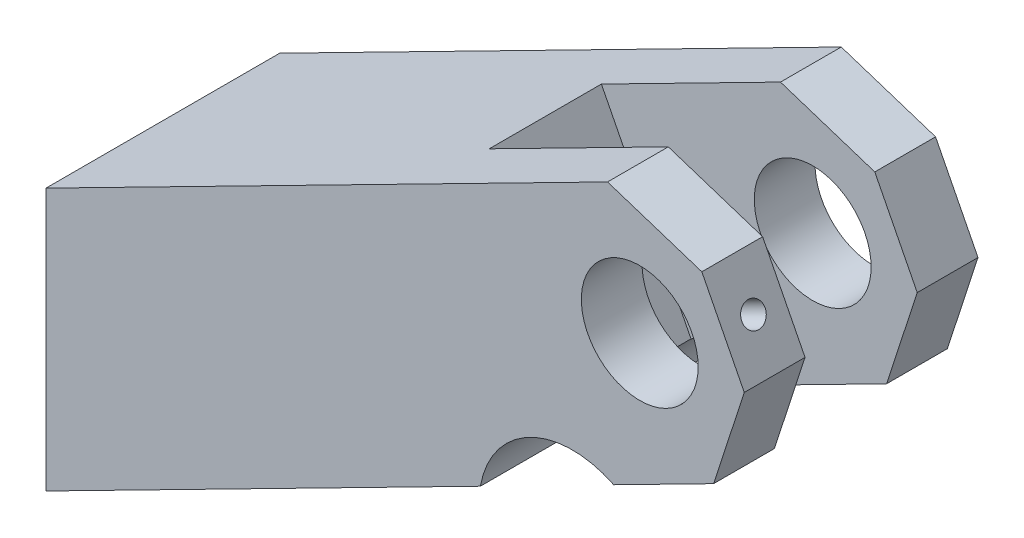
ISO-10303-21;
HEADER;
FILE_DESCRIPTION(('STEP AP214'),'2;1');
FILE_NAME('part.step','',(''),(''),'','','');
FILE_SCHEMA(('AUTOMOTIVE_DESIGN { 1 0 10303 214 1 1 1 1 }'));
ENDSEC;
DATA;
#1=APPLICATION_CONTEXT('core data for automotive mechanical design processes');
#2=APPLICATION_PROTOCOL_DEFINITION('international standard','automotive_design',2000,#1);
#3=PRODUCT_CONTEXT('',#1,'mechanical');
#4=PRODUCT('Part','Part','',(#3));
#5=PRODUCT_RELATED_PRODUCT_CATEGORY('part','',(#4));
#6=PRODUCT_DEFINITION_FORMATION('','',#4);
#7=PRODUCT_DEFINITION_CONTEXT('part definition',#1,'design');
#8=PRODUCT_DEFINITION('design','',#6,#7);
#9=PRODUCT_DEFINITION_SHAPE('','',#8);
#10=(LENGTH_UNIT() NAMED_UNIT(*) SI_UNIT(.MILLI.,.METRE.));
#11=(NAMED_UNIT(*) PLANE_ANGLE_UNIT() SI_UNIT($,.RADIAN.));
#12=(NAMED_UNIT(*) SI_UNIT($,.STERADIAN.) SOLID_ANGLE_UNIT());
#13=UNCERTAINTY_MEASURE_WITH_UNIT(LENGTH_MEASURE(1.E-05),#10,'distance_accuracy_value','');
#14=(GEOMETRIC_REPRESENTATION_CONTEXT(3) GLOBAL_UNCERTAINTY_ASSIGNED_CONTEXT((#13)) GLOBAL_UNIT_ASSIGNED_CONTEXT((#10,
#11,#12)) REPRESENTATION_CONTEXT('',''));
#15=CARTESIAN_POINT('',(0.,0.,0.));
#16=DIRECTION('',(0.,0.,1.));
#17=DIRECTION('',(1.,0.,0.));
#18=AXIS2_PLACEMENT_3D('',#15,#16,#17);
#19=CARTESIAN_POINT('',(112.635970856735,-12.1933330533112,25.));
#20=DIRECTION('',(0.,0.,-1.));
#21=DIRECTION('',(-1.,0.,0.));
#22=AXIS2_PLACEMENT_3D('',#19,#20,#21);
#23=CYLINDRICAL_SURFACE('',#22,20.);
#24=CARTESIAN_POINT('',(112.635970856735,-12.1933330533112,-12.));
#25=DIRECTION('',(0.,0.,1.));
#26=DIRECTION('',(1.,0.,0.));
#27=AXIS2_PLACEMENT_3D('',#24,#25,#26);
#28=CIRCLE('',#27,20.);
#29=CARTESIAN_POINT('',(100.985870289948,4.06320891550088,-12.));
#30=VERTEX_POINT('',#29);
#31=CARTESIAN_POINT('',(121.444189246875,5.76259323278198,-12.));
#32=VERTEX_POINT('',#31);
#33=EDGE_CURVE('E250',#30,#32,#28,.F.);
#34=ORIENTED_EDGE('',*,*,#33,.F.);
#35=DIRECTION('',(0.,0.,-1.));
#36=VECTOR('',#35,1.);
#37=CARTESIAN_POINT('',(100.985870289948,4.06320891550088,25.));
#38=LINE('',#37,#36);
#39=CARTESIAN_POINT('',(100.985870289948,4.06320891550088,12.));
#40=VERTEX_POINT('',#39);
#41=EDGE_CURVE('E165',#30,#40,#38,.F.);
#42=ORIENTED_EDGE('',*,*,#41,.T.);
#43=CARTESIAN_POINT('',(112.635970856735,-12.1933330533112,12.));
#44=DIRECTION('',(0.,0.,1.));
#45=DIRECTION('',(1.,0.,0.));
#46=AXIS2_PLACEMENT_3D('',#43,#44,#45);
#47=CIRCLE('',#46,20.);
#48=CARTESIAN_POINT('',(121.444189246875,5.76259323278198,12.));
#49=VERTEX_POINT('',#48);
#50=EDGE_CURVE('E241',#40,#49,#47,.F.);
#51=ORIENTED_EDGE('',*,*,#50,.T.);
#52=DIRECTION('',(0.,0.,-1.));
#53=VECTOR('',#52,1.);
#54=CARTESIAN_POINT('',(121.444189246875,5.76259323278198,25.));
#55=LINE('',#54,#53);
#56=CARTESIAN_POINT('',(121.444189246875,5.76259323278198,25.));
#57=VERTEX_POINT('',#56);
#58=EDGE_CURVE('E194',#57,#49,#55,.T.);
#59=ORIENTED_EDGE('',*,*,#58,.F.);
#60=CARTESIAN_POINT('',(112.635970856735,-12.1933330533112,25.));
#61=DIRECTION('',(0.,0.,-1.));
#62=DIRECTION('',(1.,0.,0.));
#63=AXIS2_PLACEMENT_3D('',#60,#61,#62);
#64=CIRCLE('',#63,20.);
#65=CARTESIAN_POINT('',(92.9319804728469,-8.76510275888345,25.));
#66=VERTEX_POINT('',#65);
#67=EDGE_CURVE('E257',#66,#57,#64,.T.);
#68=ORIENTED_EDGE('',*,*,#67,.F.);
#69=DIRECTION('',(0.,0.,-1.));
#70=VECTOR('',#69,1.);
#71=CARTESIAN_POINT('',(92.9319804728469,-8.76510275888345,25.));
#72=LINE('',#71,#70);
#73=CARTESIAN_POINT('',(92.9319804728469,-8.76510275888345,-25.));
#74=VERTEX_POINT('',#73);
#75=EDGE_CURVE('E197',#66,#74,#72,.T.);
#76=ORIENTED_EDGE('',*,*,#75,.T.);
#77=CARTESIAN_POINT('',(112.635970856735,-12.1933330533112,-25.));
#78=DIRECTION('',(0.,0.,-1.));
#79=DIRECTION('',(1.,0.,0.));
#80=AXIS2_PLACEMENT_3D('',#77,#78,#79);
#81=CIRCLE('',#80,20.);
#82=CARTESIAN_POINT('',(121.444189246875,5.76259323278198,-25.));
#83=VERTEX_POINT('',#82);
#84=EDGE_CURVE('E167',#74,#83,#81,.T.);
#85=ORIENTED_EDGE('',*,*,#84,.T.);
#86=EDGE_CURVE('E193',#32,#83,#55,.T.);
#87=ORIENTED_EDGE('',*,*,#86,.F.);
#88=EDGE_LOOP('',(#34,#42,#51,#59,#68,#76,#85,#87));
#89=FACE_BOUND('',#88,.T.);
#90=ADVANCED_FACE('F43',(#89),#23,.F.);
#91=CARTESIAN_POINT('',(142.828345827396,16.658365226531,25.));
#92=DIRECTION('',(-0.453990499739545,0.891006524188369,0.));
#93=DIRECTION('',(-0.891006524188369,-0.453990499739545,0.));
#94=AXIS2_PLACEMENT_3D('',#91,#92,#93);
#95=PLANE('',#94);
#96=DIRECTION('',(0.891006524188369,0.453990499739545,0.));
#97=VECTOR('',#96,1.);
#98=CARTESIAN_POINT('',(104.515065287296,-2.86322626226939,-12.));
#99=LINE('',#98,#97);
#100=CARTESIAN_POINT('',(142.828345827396,16.658365226531,-12.));
#101=VERTEX_POINT('',#100);
#102=EDGE_CURVE('E227',#32,#101,#99,.T.);
#103=ORIENTED_EDGE('',*,*,#102,.F.);
#104=ORIENTED_EDGE('',*,*,#86,.T.);
#105=DIRECTION('',(0.891006524188369,0.453990499739545,0.));
#106=VECTOR('',#105,1.);
#107=CARTESIAN_POINT('',(142.828345827396,16.658365226531,-25.));
#108=LINE('',#107,#106);
#109=CARTESIAN_POINT('',(142.828345827396,16.658365226531,-25.));
#110=VERTEX_POINT('',#109);
#111=EDGE_CURVE('E170',#83,#110,#108,.T.);
#112=ORIENTED_EDGE('',*,*,#111,.T.);
#113=DIRECTION('',(0.,0.,-1.));
#114=VECTOR('',#113,1.);
#115=CARTESIAN_POINT('',(142.828345827396,16.658365226531,25.));
#116=LINE('',#115,#114);
#117=EDGE_CURVE('E189',#101,#110,#116,.T.);
#118=ORIENTED_EDGE('',*,*,#117,.F.);
#119=EDGE_LOOP('',(#103,#104,#112,#118));
#120=FACE_BOUND('',#119,.T.);
#121=ADVANCED_FACE('F333',(#120),#95,.F.);
#122=CARTESIAN_POINT('',(149.383586194128,36.8333205854497,25.));
#123=DIRECTION('',(-0.951056516295152,0.309016994374951,0.));
#124=DIRECTION('',(-0.309016994374951,-0.951056516295152,0.));
#125=AXIS2_PLACEMENT_3D('',#122,#123,#124);
#126=PLANE('',#125);
#127=DIRECTION('',(0.309016994374951,0.951056516295152,0.));
#128=VECTOR('',#127,1.);
#129=CARTESIAN_POINT('',(149.383586194128,36.8333205854497,-12.));
#130=LINE('',#129,#128);
#131=CARTESIAN_POINT('',(149.383586194128,36.8333205854497,-12.));
#132=VERTEX_POINT('',#131);
#133=EDGE_CURVE('E247',#101,#132,#130,.T.);
#134=ORIENTED_EDGE('',*,*,#133,.F.);
#135=ORIENTED_EDGE('',*,*,#117,.T.);
#136=DIRECTION('',(0.309016994374951,0.951056516295152,0.));
#137=VECTOR('',#136,1.);
#138=CARTESIAN_POINT('',(149.383586194128,36.8333205854497,-25.));
#139=LINE('',#138,#137);
#140=CARTESIAN_POINT('',(149.383586194128,36.8333205854497,-25.));
#141=VERTEX_POINT('',#140);
#142=EDGE_CURVE('E173',#110,#141,#139,.T.);
#143=ORIENTED_EDGE('',*,*,#142,.T.);
#144=DIRECTION('',(0.,0.,-1.));
#145=VECTOR('',#144,1.);
#146=CARTESIAN_POINT('',(149.383586194128,36.8333205854497,25.));
#147=LINE('',#146,#145);
#148=EDGE_CURVE('E150',#132,#141,#147,.T.);
#149=ORIENTED_EDGE('',*,*,#148,.F.);
#150=EDGE_LOOP('',(#134,#135,#143,#149));
#151=FACE_BOUND('',#150,.T.);
#152=ADVANCED_FACE('F339',(#151),#126,.F.);
#153=CARTESIAN_POINT('',(140.303776199337,54.6534510692171,25.));
#154=DIRECTION('',(-0.891006524188369,-0.453990499739545,0.));
#155=DIRECTION('',(0.453990499739545,-0.891006524188369,0.));
#156=AXIS2_PLACEMENT_3D('',#153,#154,#155);
#157=PLANE('',#156);
#158=DIRECTION('',(-0.453990499739545,0.891006524188369,0.));
#159=VECTOR('',#158,1.);
#160=CARTESIAN_POINT('',(156.193443690221,23.4682227226242,-12.));
#161=LINE('',#160,#159);
#162=CARTESIAN_POINT('',(140.303776199337,54.653451069217,-12.));
#163=VERTEX_POINT('',#162);
#164=EDGE_CURVE('E220',#132,#163,#161,.T.);
#165=ORIENTED_EDGE('',*,*,#164,.F.);
#166=ORIENTED_EDGE('',*,*,#148,.T.);
#167=DIRECTION('',(-0.453990499739545,0.891006524188369,0.));
#168=VECTOR('',#167,1.);
#169=CARTESIAN_POINT('',(140.303776199337,54.6534510692171,-25.));
#170=LINE('',#169,#168);
#171=CARTESIAN_POINT('',(140.303776199337,54.6534510692171,-25.));
#172=VERTEX_POINT('',#171);
#173=EDGE_CURVE('E176',#141,#172,#170,.T.);
#174=ORIENTED_EDGE('',*,*,#173,.T.);
#175=DIRECTION('',(0.,0.,-1.));
#176=VECTOR('',#175,1.);
#177=CARTESIAN_POINT('',(140.303776199337,54.6534510692171,25.));
#178=LINE('',#177,#176);
#179=EDGE_CURVE('E151',#163,#172,#178,.T.);
#180=ORIENTED_EDGE('',*,*,#179,.F.);
#181=EDGE_LOOP('',(#165,#166,#174,#180));
#182=FACE_BOUND('',#181,.T.);
#183=ADVANCED_FACE('F372',(#182),#157,.F.);
#184=CARTESIAN_POINT('',(120.128820840418,61.2086914359495,25.));
#185=DIRECTION('',(-0.309016994374952,-0.951056516295152,0.));
#186=DIRECTION('',(0.951056516295152,-0.309016994374952,0.));
#187=AXIS2_PLACEMENT_3D('',#184,#185,#186);
#188=PLANE('',#187);
#189=DIRECTION('',(-0.951056516295152,0.309016994374952,0.));
#190=VECTOR('',#189,1.);
#191=CARTESIAN_POINT('',(120.128820840418,61.2086914359495,-12.));
#192=LINE('',#191,#190);
#193=CARTESIAN_POINT('',(120.128820840418,61.2086914359495,-12.));
#194=VERTEX_POINT('',#193);
#195=EDGE_CURVE('E244',#163,#194,#192,.T.);
#196=ORIENTED_EDGE('',*,*,#195,.F.);
#197=ORIENTED_EDGE('',*,*,#179,.T.);
#198=DIRECTION('',(-0.951056516295152,0.309016994374952,0.));
#199=VECTOR('',#198,1.);
#200=CARTESIAN_POINT('',(120.128820840418,61.2086914359495,-25.));
#201=LINE('',#200,#199);
#202=CARTESIAN_POINT('',(120.128820840418,61.2086914359495,-25.));
#203=VERTEX_POINT('',#202);
#204=EDGE_CURVE('E179',#172,#203,#201,.T.);
#205=ORIENTED_EDGE('',*,*,#204,.T.);
#206=DIRECTION('',(0.,0.,-1.));
#207=VECTOR('',#206,1.);
#208=CARTESIAN_POINT('',(120.128820840418,61.2086914359495,25.));
#209=LINE('',#208,#207);
#210=EDGE_CURVE('E185',#194,#203,#209,.T.);
#211=ORIENTED_EDGE('',*,*,#210,.F.);
#212=EDGE_LOOP('',(#196,#197,#205,#211));
#213=FACE_BOUND('',#212,.T.);
#214=ADVANCED_FACE('F308',(#213),#188,.F.);
#215=CARTESIAN_POINT('',(0.,0.,25.));
#216=DIRECTION('',(0.453990499739545,-0.891006524188369,0.));
#217=DIRECTION('',(0.891006524188369,0.453990499739545,0.));
#218=AXIS2_PLACEMENT_3D('',#215,#216,#217);
#219=PLANE('',#218);
#220=DIRECTION('',(-0.891006524188369,-0.453990499739545,0.));
#221=VECTOR('',#220,1.);
#222=CARTESIAN_POINT('',(0.,0.,-12.));
#223=LINE('',#222,#221);
#224=CARTESIAN_POINT('',(81.8155403003184,41.6870999471491,-12.));
#225=VERTEX_POINT('',#224);
#226=EDGE_CURVE('E11',#194,#225,#223,.T.);
#227=ORIENTED_EDGE('',*,*,#226,.F.);
#228=ORIENTED_EDGE('',*,*,#210,.T.);
#229=DIRECTION('',(-0.891006524188369,-0.453990499739545,0.));
#230=VECTOR('',#229,1.);
#231=CARTESIAN_POINT('',(0.,0.,-25.));
#232=LINE('',#231,#230);
#233=CARTESIAN_POINT('',(0.,0.,-25.));
#234=VERTEX_POINT('',#233);
#235=EDGE_CURVE('E105',#203,#234,#232,.T.);
#236=ORIENTED_EDGE('',*,*,#235,.T.);
#237=DIRECTION('',(0.,0.,-1.));
#238=VECTOR('',#237,1.);
#239=CARTESIAN_POINT('',(0.,0.,25.));
#240=LINE('',#239,#238);
#241=CARTESIAN_POINT('',(0.,0.,25.));
#242=VERTEX_POINT('',#241);
#243=EDGE_CURVE('E157',#242,#234,#240,.T.);
#244=ORIENTED_EDGE('',*,*,#243,.F.);
#245=DIRECTION('',(-0.891006524188369,-0.453990499739545,0.));
#246=VECTOR('',#245,1.);
#247=CARTESIAN_POINT('',(0.,0.,25.));
#248=LINE('',#247,#246);
#249=CARTESIAN_POINT('',(120.128820840418,61.2086914359495,25.));
#250=VERTEX_POINT('',#249);
#251=EDGE_CURVE('E73',#250,#242,#248,.T.);
#252=ORIENTED_EDGE('',*,*,#251,.F.);
#253=CARTESIAN_POINT('',(120.128820840418,61.2086914359495,12.));
#254=VERTEX_POINT('',#253);
#255=EDGE_CURVE('E155',#250,#254,#209,.T.);
#256=ORIENTED_EDGE('',*,*,#255,.T.);
#257=DIRECTION('',(-0.891006524188369,-0.453990499739545,0.));
#258=VECTOR('',#257,1.);
#259=CARTESIAN_POINT('',(0.,0.,12.));
#260=LINE('',#259,#258);
#261=CARTESIAN_POINT('',(81.8155403003184,41.6870999471491,12.));
#262=VERTEX_POINT('',#261);
#263=EDGE_CURVE('E56',#254,#262,#260,.T.);
#264=ORIENTED_EDGE('',*,*,#263,.T.);
#265=DIRECTION('',(0.,0.,1.));
#266=VECTOR('',#265,1.);
#267=CARTESIAN_POINT('',(81.8155403003184,41.6870999471491,-12.));
#268=LINE('',#267,#266);
#269=EDGE_CURVE('E230',#225,#262,#268,.T.);
#270=ORIENTED_EDGE('',*,*,#269,.F.);
#271=EDGE_LOOP('',(#227,#228,#236,#244,#252,#256,#264,#270));
#272=FACE_BOUND('',#271,.T.);
#273=ADVANCED_FACE('F307',(#272),#219,.F.);
#274=CARTESIAN_POINT('',(0.,-56.116311881718,25.));
#275=DIRECTION('',(1.,0.,0.));
#276=DIRECTION('',(0.,1.,0.));
#277=AXIS2_PLACEMENT_3D('',#274,#275,#276);
#278=PLANE('',#277);
#279=CARTESIAN_POINT('',(0.,-12.,-12.5));
#280=DIRECTION('',(-1.,0.,0.));
#281=DIRECTION('',(0.,0.,1.));
#282=AXIS2_PLACEMENT_3D('',#279,#280,#281);
#283=CIRCLE('',#282,5.1);
#284=CARTESIAN_POINT('',(0.,-12.,-7.4));
#285=VERTEX_POINT('',#284);
#286=EDGE_CURVE('E601',#285,#285,#283,.T.);
#287=ORIENTED_EDGE('',*,*,#286,.F.);
#288=EDGE_LOOP('',(#287));
#289=FACE_BOUND('',#288,.T.);
#290=CARTESIAN_POINT('',(0.,-12.,12.5));
#291=DIRECTION('',(-1.,0.,0.));
#292=DIRECTION('',(0.,0.,1.));
#293=AXIS2_PLACEMENT_3D('',#290,#291,#292);
#294=CIRCLE('',#293,5.1);
#295=CARTESIAN_POINT('',(0.,-12.,17.6));
#296=VERTEX_POINT('',#295);
#297=EDGE_CURVE('E595',#296,#296,#294,.T.);
#298=ORIENTED_EDGE('',*,*,#297,.F.);
#299=EDGE_LOOP('',(#298));
#300=FACE_BOUND('',#299,.T.);
#301=CARTESIAN_POINT('',(0.,-32.,0.));
#302=DIRECTION('',(-1.,0.,0.));
#303=DIRECTION('',(0.,0.,1.));
#304=AXIS2_PLACEMENT_3D('',#301,#302,#303);
#305=CIRCLE('',#304,5.1);
#306=CARTESIAN_POINT('',(0.,-32.,5.1));
#307=VERTEX_POINT('',#306);
#308=EDGE_CURVE('E587',#307,#307,#305,.T.);
#309=ORIENTED_EDGE('',*,*,#308,.F.);
#310=EDGE_LOOP('',(#309));
#311=FACE_BOUND('',#310,.T.);
#312=DIRECTION('',(0.,-1.,0.));
#313=VECTOR('',#312,1.);
#314=CARTESIAN_POINT('',(0.,-56.116311881718,-25.));
#315=LINE('',#314,#313);
#316=CARTESIAN_POINT('',(0.,-56.116311881718,-25.));
#317=VERTEX_POINT('',#316);
#318=EDGE_CURVE('E161',#234,#317,#315,.T.);
#319=ORIENTED_EDGE('',*,*,#318,.T.);
#320=DIRECTION('',(0.,0.,-1.));
#321=VECTOR('',#320,1.);
#322=CARTESIAN_POINT('',(0.,-56.116311881718,25.));
#323=LINE('',#322,#321);
#324=CARTESIAN_POINT('',(0.,-56.116311881718,25.));
#325=VERTEX_POINT('',#324);
#326=EDGE_CURVE('E200',#325,#317,#323,.T.);
#327=ORIENTED_EDGE('',*,*,#326,.F.);
#328=DIRECTION('',(0.,-1.,0.));
#329=VECTOR('',#328,1.);
#330=CARTESIAN_POINT('',(0.,-56.116311881718,25.));
#331=LINE('',#330,#329);
#332=EDGE_CURVE('E183',#242,#325,#331,.T.);
#333=ORIENTED_EDGE('',*,*,#332,.F.);
#334=ORIENTED_EDGE('',*,*,#243,.T.);
#335=EDGE_LOOP('',(#319,#327,#333,#334));
#336=FACE_BOUND('',#335,.T.);
#337=ADVANCED_FACE('F45',(#289,#300,#311,#336),#278,.F.);
#338=CARTESIAN_POINT('',(92.9319804728469,-8.76510275888345,25.));
#339=DIRECTION('',(-0.453990499739545,0.891006524188369,0.));
#340=DIRECTION('',(-0.891006524188369,-0.453990499739545,0.));
#341=AXIS2_PLACEMENT_3D('',#338,#339,#340);
#342=PLANE('',#341);
#343=DIRECTION('',(0.891006524188369,0.453990499739545,0.));
#344=VECTOR('',#343,1.);
#345=CARTESIAN_POINT('',(92.9319804728469,-8.76510275888345,-25.));
#346=LINE('',#345,#344);
#347=EDGE_CURVE('E164',#317,#74,#346,.T.);
#348=ORIENTED_EDGE('',*,*,#347,.T.);
#349=ORIENTED_EDGE('',*,*,#75,.F.);
#350=DIRECTION('',(0.891006524188369,0.453990499739545,0.));
#351=VECTOR('',#350,1.);
#352=CARTESIAN_POINT('',(92.9319804728469,-8.76510275888345,25.));
#353=LINE('',#352,#351);
#354=EDGE_CURVE('E114',#325,#66,#353,.T.);
#355=ORIENTED_EDGE('',*,*,#354,.F.);
#356=ORIENTED_EDGE('',*,*,#326,.T.);
#357=EDGE_LOOP('',(#348,#349,#355,#356));
#358=FACE_BOUND('',#357,.T.);
#359=ADVANCED_FACE('F344',(#358),#342,.F.);
#360=ORIENTED_EDGE('',*,*,#58,.T.);
#361=DIRECTION('',(0.891006524188369,0.453990499739545,0.));
#362=VECTOR('',#361,1.);
#363=CARTESIAN_POINT('',(104.515065287296,-2.86322626226939,12.));
#364=LINE('',#363,#362);
#365=CARTESIAN_POINT('',(142.828345827396,16.658365226531,12.));
#366=VERTEX_POINT('',#365);
#367=EDGE_CURVE('E224',#49,#366,#364,.T.);
#368=ORIENTED_EDGE('',*,*,#367,.T.);
#369=CARTESIAN_POINT('',(142.828345827396,16.658365226531,25.));
#370=VERTEX_POINT('',#369);
#371=EDGE_CURVE('E190',#370,#366,#116,.T.);
#372=ORIENTED_EDGE('',*,*,#371,.F.);
#373=DIRECTION('',(0.891006524188369,0.453990499739545,0.));
#374=VECTOR('',#373,1.);
#375=CARTESIAN_POINT('',(142.828345827396,16.658365226531,25.));
#376=LINE('',#375,#374);
#377=EDGE_CURVE('E259',#57,#370,#376,.T.);
#378=ORIENTED_EDGE('',*,*,#377,.F.);
#379=EDGE_LOOP('',(#360,#368,#372,#378));
#380=FACE_BOUND('',#379,.T.);
#381=ADVANCED_FACE('F265',(#380),#95,.F.);
#382=ORIENTED_EDGE('',*,*,#371,.T.);
#383=DIRECTION('',(0.309016994374951,0.951056516295152,0.));
#384=VECTOR('',#383,1.);
#385=CARTESIAN_POINT('',(149.383586194128,36.8333205854497,12.));
#386=LINE('',#385,#384);
#387=CARTESIAN_POINT('',(149.383586194128,36.8333205854497,12.));
#388=VERTEX_POINT('',#387);
#389=EDGE_CURVE('E238',#366,#388,#386,.T.);
#390=ORIENTED_EDGE('',*,*,#389,.T.);
#391=CARTESIAN_POINT('',(149.383586194128,36.8333205854497,25.));
#392=VERTEX_POINT('',#391);
#393=EDGE_CURVE('E187',#392,#388,#147,.T.);
#394=ORIENTED_EDGE('',*,*,#393,.F.);
#395=DIRECTION('',(0.309016994374951,0.951056516295152,0.));
#396=VECTOR('',#395,1.);
#397=CARTESIAN_POINT('',(149.383586194128,36.8333205854497,25.));
#398=LINE('',#397,#396);
#399=EDGE_CURVE('E136',#370,#392,#398,.T.);
#400=ORIENTED_EDGE('',*,*,#399,.F.);
#401=EDGE_LOOP('',(#382,#390,#394,#400));
#402=FACE_BOUND('',#401,.T.);
#403=ADVANCED_FACE('F269',(#402),#126,.F.);
#404=CARTESIAN_POINT('',(144.843681196732,45.7433858273334,18.5));
#405=DIRECTION('',(0.891006524188369,0.453990499739545,0.));
#406=DIRECTION('',(-0.453990499739545,0.891006524188369,0.));
#407=AXIS2_PLACEMENT_3D('',#404,#405,#406);
#408=CIRCLE('',#407,2.49999999999999);
#409=CARTESIAN_POINT('',(143.708704947384,47.9709021378043,18.5));
#410=VERTEX_POINT('',#409);
#411=EDGE_CURVE('E582',#410,#410,#408,.T.);
#412=ORIENTED_EDGE('',*,*,#411,.F.);
#413=EDGE_LOOP('',(#412));
#414=FACE_BOUND('',#413,.T.);
#415=ORIENTED_EDGE('',*,*,#393,.T.);
#416=DIRECTION('',(-0.453990499739545,0.891006524188369,0.));
#417=VECTOR('',#416,1.);
#418=CARTESIAN_POINT('',(156.193443690221,23.4682227226242,12.));
#419=LINE('',#418,#417);
#420=CARTESIAN_POINT('',(140.303776199337,54.653451069217,12.));
#421=VERTEX_POINT('',#420);
#422=EDGE_CURVE('E147',#388,#421,#419,.T.);
#423=ORIENTED_EDGE('',*,*,#422,.T.);
#424=CARTESIAN_POINT('',(140.303776199337,54.6534510692171,25.));
#425=VERTEX_POINT('',#424);
#426=EDGE_CURVE('E143',#425,#421,#178,.T.);
#427=ORIENTED_EDGE('',*,*,#426,.F.);
#428=DIRECTION('',(-0.453990499739545,0.891006524188369,0.));
#429=VECTOR('',#428,1.);
#430=CARTESIAN_POINT('',(140.303776199337,54.6534510692171,25.));
#431=LINE('',#430,#429);
#432=EDGE_CURVE('E129',#392,#425,#431,.T.);
#433=ORIENTED_EDGE('',*,*,#432,.F.);
#434=EDGE_LOOP('',(#415,#423,#427,#433));
#435=FACE_BOUND('',#434,.T.);
#436=ADVANCED_FACE('F144',(#414,#435),#157,.F.);
#437=ORIENTED_EDGE('',*,*,#426,.T.);
#438=DIRECTION('',(-0.951056516295152,0.309016994374952,0.));
#439=VECTOR('',#438,1.);
#440=CARTESIAN_POINT('',(120.128820840418,61.2086914359495,12.));
#441=LINE('',#440,#439);
#442=EDGE_CURVE('E236',#421,#254,#441,.T.);
#443=ORIENTED_EDGE('',*,*,#442,.T.);
#444=ORIENTED_EDGE('',*,*,#255,.F.);
#445=DIRECTION('',(-0.951056516295152,0.309016994374952,0.));
#446=VECTOR('',#445,1.);
#447=CARTESIAN_POINT('',(120.128820840418,61.2086914359495,25.));
#448=LINE('',#447,#446);
#449=EDGE_CURVE('E133',#425,#250,#448,.T.);
#450=ORIENTED_EDGE('',*,*,#449,.F.);
#451=EDGE_LOOP('',(#437,#443,#444,#450));
#452=FACE_BOUND('',#451,.T.);
#453=ADVANCED_FACE('F153',(#452),#188,.F.);
#454=CARTESIAN_POINT('',(112.635970856735,-12.1933330533112,25.));
#455=DIRECTION('',(0.,0.,1.));
#456=DIRECTION('',(1.,0.,0.));
#457=AXIS2_PLACEMENT_3D('',#454,#455,#456);
#458=PLANE('',#457);
#459=CARTESIAN_POINT('',(127.023550712965,36.6635758325425,25.));
#460=DIRECTION('',(0.,0.,1.));
#461=DIRECTION('',(1.,0.,0.));
#462=AXIS2_PLACEMENT_3D('',#459,#460,#461);
#463=CIRCLE('',#462,12.5);
#464=CARTESIAN_POINT('',(139.523550712965,36.6635758325425,25.));
#465=VERTEX_POINT('',#464);
#466=EDGE_CURVE('E212',#465,#465,#463,.T.);
#467=ORIENTED_EDGE('',*,*,#466,.F.);
#468=EDGE_LOOP('',(#467));
#469=FACE_BOUND('',#468,.T.);
#470=ORIENTED_EDGE('',*,*,#332,.T.);
#471=ORIENTED_EDGE('',*,*,#354,.T.);
#472=ORIENTED_EDGE('',*,*,#67,.T.);
#473=ORIENTED_EDGE('',*,*,#377,.T.);
#474=ORIENTED_EDGE('',*,*,#399,.T.);
#475=ORIENTED_EDGE('',*,*,#432,.T.);
#476=ORIENTED_EDGE('',*,*,#449,.T.);
#477=ORIENTED_EDGE('',*,*,#251,.T.);
#478=EDGE_LOOP('',(#470,#471,#472,#473,#474,#475,#476,#477));
#479=FACE_BOUND('',#478,.T.);
#480=ADVANCED_FACE('F131',(#469,#479),#458,.T.);
#481=CARTESIAN_POINT('',(112.635970856735,-12.1933330533112,-25.));
#482=DIRECTION('',(0.,0.,1.));
#483=DIRECTION('',(1.,0.,0.));
#484=AXIS2_PLACEMENT_3D('',#481,#482,#483);
#485=PLANE('',#484);
#486=CARTESIAN_POINT('',(127.023550712965,36.6635758325425,-25.));
#487=DIRECTION('',(0.,0.,1.));
#488=DIRECTION('',(1.,0.,0.));
#489=AXIS2_PLACEMENT_3D('',#486,#487,#488);
#490=CIRCLE('',#489,12.5);
#491=CARTESIAN_POINT('',(139.523550712965,36.6635758325425,-25.));
#492=VERTEX_POINT('',#491);
#493=EDGE_CURVE('E206',#492,#492,#490,.T.);
#494=ORIENTED_EDGE('',*,*,#493,.T.);
#495=EDGE_LOOP('',(#494));
#496=FACE_BOUND('',#495,.T.);
#497=ORIENTED_EDGE('',*,*,#318,.F.);
#498=ORIENTED_EDGE('',*,*,#235,.F.);
#499=ORIENTED_EDGE('',*,*,#204,.F.);
#500=ORIENTED_EDGE('',*,*,#173,.F.);
#501=ORIENTED_EDGE('',*,*,#142,.F.);
#502=ORIENTED_EDGE('',*,*,#111,.F.);
#503=ORIENTED_EDGE('',*,*,#84,.F.);
#504=ORIENTED_EDGE('',*,*,#347,.F.);
#505=EDGE_LOOP('',(#497,#498,#499,#500,#501,#502,#503,#504));
#506=FACE_BOUND('',#505,.T.);
#507=ADVANCED_FACE('F313',(#496,#506),#485,.F.);
#508=CARTESIAN_POINT('',(81.8155403003184,41.6870999471491,-12.));
#509=DIRECTION('',(-0.891006524188369,-0.453990499739545,0.));
#510=DIRECTION('',(0.453990499739545,-0.891006524188369,0.));
#511=AXIS2_PLACEMENT_3D('',#508,#509,#510);
#512=PLANE('',#511);
#513=DIRECTION('',(0.453990499739545,-0.891006524188369,0.));
#514=VECTOR('',#513,1.);
#515=CARTESIAN_POINT('',(81.8155403003184,41.6870999471491,-12.));
#516=LINE('',#515,#514);
#517=EDGE_CURVE('E223',#225,#30,#516,.T.);
#518=ORIENTED_EDGE('',*,*,#517,.F.);
#519=ORIENTED_EDGE('',*,*,#269,.T.);
#520=DIRECTION('',(0.453990499739545,-0.891006524188369,0.));
#521=VECTOR('',#520,1.);
#522=CARTESIAN_POINT('',(81.8155403003184,41.6870999471491,12.));
#523=LINE('',#522,#521);
#524=EDGE_CURVE('E64',#262,#40,#523,.T.);
#525=ORIENTED_EDGE('',*,*,#524,.T.);
#526=ORIENTED_EDGE('',*,*,#41,.F.);
#527=EDGE_LOOP('',(#518,#519,#525,#526));
#528=FACE_BOUND('',#527,.T.);
#529=ADVANCED_FACE('F328',(#528),#512,.F.);
#530=CARTESIAN_POINT('',(0.,0.,-12.));
#531=DIRECTION('',(0.,0.,1.));
#532=DIRECTION('',(1.,0.,0.));
#533=AXIS2_PLACEMENT_3D('',#530,#531,#532);
#534=PLANE('',#533);
#535=CARTESIAN_POINT('',(127.023550712965,36.6635758325425,-12.));
#536=DIRECTION('',(0.,0.,1.));
#537=DIRECTION('',(1.,0.,0.));
#538=AXIS2_PLACEMENT_3D('',#535,#536,#537);
#539=CIRCLE('',#538,12.5);
#540=CARTESIAN_POINT('',(139.523550712965,36.6635758325425,-12.));
#541=VERTEX_POINT('',#540);
#542=EDGE_CURVE('E203',#541,#541,#539,.T.);
#543=ORIENTED_EDGE('',*,*,#542,.F.);
#544=EDGE_LOOP('',(#543));
#545=FACE_BOUND('',#544,.T.);
#546=ORIENTED_EDGE('',*,*,#33,.T.);
#547=ORIENTED_EDGE('',*,*,#102,.T.);
#548=ORIENTED_EDGE('',*,*,#133,.T.);
#549=ORIENTED_EDGE('',*,*,#164,.T.);
#550=ORIENTED_EDGE('',*,*,#195,.T.);
#551=ORIENTED_EDGE('',*,*,#226,.T.);
#552=ORIENTED_EDGE('',*,*,#517,.T.);
#553=EDGE_LOOP('',(#546,#547,#548,#549,#550,#551,#552));
#554=FACE_BOUND('',#553,.T.);
#555=ADVANCED_FACE('F301',(#545,#554),#534,.T.);
#556=CARTESIAN_POINT('',(0.,0.,12.));
#557=DIRECTION('',(0.,0.,1.));
#558=DIRECTION('',(1.,0.,0.));
#559=AXIS2_PLACEMENT_3D('',#556,#557,#558);
#560=PLANE('',#559);
#561=CARTESIAN_POINT('',(127.023550712965,36.6635758325425,12.));
#562=DIRECTION('',(0.,0.,1.));
#563=DIRECTION('',(1.,0.,0.));
#564=AXIS2_PLACEMENT_3D('',#561,#562,#563);
#565=CIRCLE('',#564,12.5);
#566=CARTESIAN_POINT('',(139.523550712965,36.6635758325425,12.));
#567=VERTEX_POINT('',#566);
#568=EDGE_CURVE('E205',#567,#567,#565,.T.);
#569=ORIENTED_EDGE('',*,*,#568,.T.);
#570=EDGE_LOOP('',(#569));
#571=FACE_BOUND('',#570,.T.);
#572=ORIENTED_EDGE('',*,*,#524,.F.);
#573=ORIENTED_EDGE('',*,*,#263,.F.);
#574=ORIENTED_EDGE('',*,*,#442,.F.);
#575=ORIENTED_EDGE('',*,*,#422,.F.);
#576=ORIENTED_EDGE('',*,*,#389,.F.);
#577=ORIENTED_EDGE('',*,*,#367,.F.);
#578=ORIENTED_EDGE('',*,*,#50,.F.);
#579=EDGE_LOOP('',(#572,#573,#574,#575,#576,#577,#578));
#580=FACE_BOUND('',#579,.T.);
#581=ADVANCED_FACE('F318',(#571,#580),#560,.F.);
#582=CARTESIAN_POINT('',(127.023550712965,36.6635758325425,25.));
#583=DIRECTION('',(0.,0.,1.));
#584=DIRECTION('',(1.,0.,0.));
#585=AXIS2_PLACEMENT_3D('',#582,#583,#584);
#586=CYLINDRICAL_SURFACE('',#585,12.5);
#587=ORIENTED_EDGE('',*,*,#542,.T.);
#588=EDGE_LOOP('',(#587));
#589=FACE_BOUND('',#588,.T.);
#590=ORIENTED_EDGE('',*,*,#493,.F.);
#591=EDGE_LOOP('',(#590));
#592=FACE_BOUND('',#591,.T.);
#593=ADVANCED_FACE('F320',(#589,#592),#586,.F.);
#594=CARTESIAN_POINT('',(136.801131172378,44.4513175051785,18.5));
#595=CARTESIAN_POINT('',(136.801135964498,44.4513141833905,18.6389109387279));
#596=CARTESIAN_POINT('',(136.808533820285,44.4420511994246,18.7778865583333));
#597=CARTESIAN_POINT('',(136.837726161465,44.4051837086876,19.0519062628578));
#598=CARTESIAN_POINT('',(136.859532166405,44.3775645257378,19.1869471115899));
#599=CARTESIAN_POINT('',(136.916313063533,44.3046080753648,19.4490932583855));
#600=CARTESIAN_POINT('',(136.951274856589,44.2592884304796,19.5762063038315));
#601=CARTESIAN_POINT('',(137.032549789874,44.1518636069472,19.8191871117424));
#602=CARTESIAN_POINT('',(137.078862296542,44.0897593651433,19.9350555013447));
#603=CARTESIAN_POINT('',(137.181248999565,43.9490962347457,20.1539025096346));
#604=CARTESIAN_POINT('',(137.237439574954,43.8703386049823,20.2566989697099));
#605=CARTESIAN_POINT('',(137.356581463639,43.6984454959107,20.4448938339474));
#606=CARTESIAN_POINT('',(137.419533250377,43.6053090095497,20.530291018543));
#607=CARTESIAN_POINT('',(137.550050695704,43.405764822634,20.6819700440711));
#608=CARTESIAN_POINT('',(137.617651787054,43.299248523585,20.7480787845416));
#609=CARTESIAN_POINT('',(137.754180812268,43.0761152945577,20.8581873426203));
#610=CARTESIAN_POINT('',(137.823108621304,42.9594993112558,20.9021892297525));
#611=CARTESIAN_POINT('',(137.958755186258,42.7207939676138,20.9662679840491));
#612=CARTESIAN_POINT('',(138.025491082237,42.5987969682181,20.9866524439275));
#613=CARTESIAN_POINT('',(138.155444097996,42.3513234802128,21.0038773795958));
#614=CARTESIAN_POINT('',(138.218661556257,42.2258473280523,21.0007201241145));
#615=CARTESIAN_POINT('',(138.338911008189,41.9769051346094,20.9711845494611));
#616=CARTESIAN_POINT('',(138.396018267294,41.8534359143502,20.9451375570804));
#617=CARTESIAN_POINT('',(138.503840601998,41.6103560836086,20.8710874188528));
#618=CARTESIAN_POINT('',(138.554555421736,41.4907456277177,20.8230833945203));
#619=CARTESIAN_POINT('',(138.649168013593,41.2582348377835,20.7061748996318));
#620=CARTESIAN_POINT('',(138.693020811,41.1453815407617,20.6371406222378));
#621=CARTESIAN_POINT('',(138.773243531439,40.9306448119296,20.4802273069085));
#622=CARTESIAN_POINT('',(138.809612592498,40.8287626444107,20.3923461005737));
#623=CARTESIAN_POINT('',(138.875487005957,40.6374949978687,20.1984159447288));
#624=CARTESIAN_POINT('',(138.904861676419,40.5483582852618,20.092077033176));
#625=CARTESIAN_POINT('',(138.956183414796,40.3877412123563,19.8652088938731));
#626=CARTESIAN_POINT('',(138.978130342228,40.3162611860087,19.744679397792));
#627=CARTESIAN_POINT('',(139.014986337393,40.1933937736499,19.4924479204455));
#628=CARTESIAN_POINT('',(139.029880242837,40.142049715417,19.3607225809008));
#629=CARTESIAN_POINT('',(139.052878134613,40.0616704945021,19.09007169069));
#630=CARTESIAN_POINT('',(139.060983005892,40.032632424288,18.9511470809523));
#631=CARTESIAN_POINT('',(139.070527607185,39.9983415888026,18.6725878550024));
#632=CARTESIAN_POINT('',(139.072079012943,39.9926903297569,18.5330060642242));
#633=CARTESIAN_POINT('',(139.068863082164,40.004307051033,18.2548794420008));
#634=CARTESIAN_POINT('',(139.064096103933,40.0215737317179,18.1163345522029));
#635=CARTESIAN_POINT('',(139.048199876972,40.0780524725943,17.8455783992694));
#636=CARTESIAN_POINT('',(139.037132073724,40.1170525131285,17.7133191424106));
#637=CARTESIAN_POINT('',(139.008432076775,40.2153676606511,17.4573418024282));
#638=CARTESIAN_POINT('',(138.990799342307,40.2746844411356,17.3336244239107));
#639=CARTESIAN_POINT('',(138.948373457195,40.4124214254097,17.0964672251246));
#640=CARTESIAN_POINT('',(138.923489971266,40.4910805513162,16.9831823842479));
#641=CARTESIAN_POINT('',(138.866337367073,40.6644148882641,16.7717292199977));
#642=CARTESIAN_POINT('',(138.834067488574,40.7590917476517,16.6735624543769));
#643=CARTESIAN_POINT('',(138.761397908146,40.962972443304,16.4935936020361));
#644=CARTESIAN_POINT('',(138.720881009591,41.0723769726218,16.412065863375));
#645=CARTESIAN_POINT('',(138.632122448186,41.3010408000545,16.2696352962511));
#646=CARTESIAN_POINT('',(138.583881109864,41.4202996840533,16.2087316016381));
#647=CARTESIAN_POINT('',(138.480481807671,41.6641914847855,16.1096778206334));
#648=CARTESIAN_POINT('',(138.425365280592,41.78878949353,16.0713987044344));
#649=CARTESIAN_POINT('',(138.309029939619,42.0401096593544,16.0182718808404));
#650=CARTESIAN_POINT('',(138.247811861643,42.1668315587382,16.0034213513108));
#651=CARTESIAN_POINT('',(138.121965350633,42.4163474490011,15.9976825475928));
#652=CARTESIAN_POINT('',(138.057414798648,42.5391714186015,16.0063817988594));
#653=CARTESIAN_POINT('',(137.925929054184,42.779696895441,16.0465848763696));
#654=CARTESIAN_POINT('',(137.858993891699,42.8973984670698,16.0780884158703));
#655=CARTESIAN_POINT('',(137.725221946678,43.1243466456946,16.162822480229));
#656=CARTESIAN_POINT('',(137.658385286456,43.233611866902,16.2160034453274));
#657=CARTESIAN_POINT('',(137.52717126789,43.4414128419526,16.3425306033278));
#658=CARTESIAN_POINT('',(137.462794104346,43.5399477470539,16.4158783897613));
#659=CARTESIAN_POINT('',(137.338089387807,43.7256591304971,16.5820484676532));
#660=CARTESIAN_POINT('',(137.277843919336,43.8126267256611,16.6751658409594));
#661=CARTESIAN_POINT('',(137.165218901063,43.9715218200704,16.8776256002469));
#662=CARTESIAN_POINT('',(137.112841217587,44.0434457523759,16.9869718236998));
#663=CARTESIAN_POINT('',(137.017941786177,44.1714772507039,17.2201982917261));
#664=CARTESIAN_POINT('',(136.975532278778,44.2274061054424,17.3442224028031));
#665=CARTESIAN_POINT('',(136.903551896094,44.3211929346582,17.6023319331503));
#666=CARTESIAN_POINT('',(136.873969376238,44.359067302444,17.736408096718));
#667=CARTESIAN_POINT('',(136.834958105682,44.4087027285525,17.9756561386072));
#668=CARTESIAN_POINT('',(136.822311604623,44.4246627747964,18.0794635487849));
#669=CARTESIAN_POINT('',(136.805396460879,44.4459712428186,18.2888348863778));
#670=CARTESIAN_POINT('',(136.801127529368,44.4513200304292,18.3943987531112));
#671=CARTESIAN_POINT('',(136.801131172378,44.4513175051785,18.5));
#672=B_SPLINE_CURVE_WITH_KNOTS('',3,(#594,#595,#596,#597,#598,#599,#600,#601,#602,#603,#604,
#605,#606,#607,#608,#609,#610,#611,#612,#613,#614,#615,#616,#617,#618,#619,#620,#621,#622,#623,
#624,#625,#626,#627,#628,#629,#630,#631,#632,#633,#634,#635,#636,#637,#638,#639,#640,#641,#642,
#643,#644,#645,#646,#647,#648,#649,#650,#651,#652,#653,#654,#655,#656,#657,#658,#659,#660,#661,
#662,#663,#664,#665,#666,#667,#668,#669,#670,#671),.UNSPECIFIED.,.T.,.F.,(4,2,2,2,2,2,2,2,2,2,2,
2,2,2,2,2,2,2,2,2,2,2,2,2,2,2,2,2,2,2,2,2,2,2,2,2,2,2,4),(0.,0.416346159673564,
0.833025598210734,1.24929124485146,1.66553366214965,2.08705631371091,2.50860850088553,
2.93383501093621,3.35902170616397,3.77860622207698,4.19815030290619,4.61171974083843,
5.02530572684374,5.44149810555756,5.85773839425161,6.28123366906205,6.70473695306797,
7.12914657931937,7.55350087540058,7.97059394511479,8.38766336321049,8.80073354458293,
9.21383775885992,9.63232649436298,10.0508583217552,10.4758150433362,10.9007539157526,
11.3232453394662,11.7456858672906,12.1607754353671,12.5758597841688,12.9900004268862,
13.404173803367,13.8250288006399,14.2459834722445,14.6714724644901,15.0965743772549,
15.413095090954,15.7296048921369),.UNSPECIFIED.);
#673=CARTESIAN_POINT('',(136.801131172378,44.4513175051785,18.5));
#674=VERTEX_POINT('',#673);
#675=EDGE_CURVE('E47',#674,#674,#672,.T.);
#676=ORIENTED_EDGE('',*,*,#675,.T.);
#677=EDGE_LOOP('',(#676));
#678=FACE_BOUND('',#677,.T.);
#679=ORIENTED_EDGE('',*,*,#466,.T.);
#680=EDGE_LOOP('',(#679));
#681=FACE_BOUND('',#680,.T.);
#682=ORIENTED_EDGE('',*,*,#568,.F.);
#683=EDGE_LOOP('',(#682));
#684=FACE_BOUND('',#683,.T.);
#685=ADVANCED_FACE('F327',(#678,#681,#684),#586,.F.);
#686=CARTESIAN_POINT('',(144.843681196732,45.7433858273334,18.5));
#687=DIRECTION('',(0.891006524188369,0.453990499739545,0.));
#688=DIRECTION('',(-0.453990499739545,0.891006524188369,0.));
#689=AXIS2_PLACEMENT_3D('',#686,#687,#688);
#690=CYLINDRICAL_SURFACE('',#689,2.49999999999999);
#691=ORIENTED_EDGE('',*,*,#411,.T.);
#692=EDGE_LOOP('',(#691));
#693=FACE_BOUND('',#692,.T.);
#694=ORIENTED_EDGE('',*,*,#675,.F.);
#695=EDGE_LOOP('',(#694));
#696=FACE_BOUND('',#695,.T.);
#697=ADVANCED_FACE('F404',(#693,#696),#690,.F.);
#698=CARTESIAN_POINT('',(25.,-32.,0.));
#699=DIRECTION('',(-1.,0.,0.));
#700=DIRECTION('',(0.,0.,1.));
#701=AXIS2_PLACEMENT_3D('',#698,#699,#700);
#702=CONICAL_SURFACE('',#701,5.09999999999999,1.02974425867665);
#703=CARTESIAN_POINT('',(28.0643891570406,-32.,0.));
#704=VERTEX_POINT('',#703);
#705=VERTEX_LOOP('',#704);
#706=FACE_BOUND('',#705,.T.);
#707=CARTESIAN_POINT('',(25.,-32.,0.));
#708=DIRECTION('',(-1.,0.,0.));
#709=DIRECTION('',(0.,0.,1.));
#710=AXIS2_PLACEMENT_3D('',#707,#708,#709);
#711=CIRCLE('',#710,5.09999999999999);
#712=CARTESIAN_POINT('',(25.,-32.,5.09999999999999));
#713=VERTEX_POINT('',#712);
#714=EDGE_CURVE('E584',#713,#713,#711,.T.);
#715=ORIENTED_EDGE('',*,*,#714,.T.);
#716=EDGE_LOOP('',(#715));
#717=FACE_BOUND('',#716,.T.);
#718=ADVANCED_FACE('F409',(#706,#717),#702,.F.);
#719=CARTESIAN_POINT('',(0.,-32.,0.));
#720=DIRECTION('',(-1.,0.,0.));
#721=DIRECTION('',(0.,0.,1.));
#722=AXIS2_PLACEMENT_3D('',#719,#720,#721);
#723=CYLINDRICAL_SURFACE('',#722,5.1);
#724=ORIENTED_EDGE('',*,*,#714,.F.);
#725=EDGE_LOOP('',(#724));
#726=FACE_BOUND('',#725,.T.);
#727=ORIENTED_EDGE('',*,*,#308,.T.);
#728=EDGE_LOOP('',(#727));
#729=FACE_BOUND('',#728,.T.);
#730=ADVANCED_FACE('F414',(#726,#729),#723,.F.);
#731=CARTESIAN_POINT('',(25.,-12.,12.5));
#732=DIRECTION('',(-1.,0.,0.));
#733=DIRECTION('',(0.,0.,1.));
#734=AXIS2_PLACEMENT_3D('',#731,#732,#733);
#735=CONICAL_SURFACE('',#734,5.09999999999999,1.02974425867665);
#736=CARTESIAN_POINT('',(28.0643891570406,-12.,12.5));
#737=VERTEX_POINT('',#736);
#738=VERTEX_LOOP('',#737);
#739=FACE_BOUND('',#738,.T.);
#740=CARTESIAN_POINT('',(25.,-12.,12.5));
#741=DIRECTION('',(-1.,0.,0.));
#742=DIRECTION('',(0.,0.,1.));
#743=AXIS2_PLACEMENT_3D('',#740,#741,#742);
#744=CIRCLE('',#743,5.09999999999999);
#745=CARTESIAN_POINT('',(25.,-12.,17.6));
#746=VERTEX_POINT('',#745);
#747=EDGE_CURVE('E592',#746,#746,#744,.T.);
#748=ORIENTED_EDGE('',*,*,#747,.T.);
#749=EDGE_LOOP('',(#748));
#750=FACE_BOUND('',#749,.T.);
#751=ADVANCED_FACE('F426',(#739,#750),#735,.F.);
#752=CARTESIAN_POINT('',(0.,-12.,12.5));
#753=DIRECTION('',(-1.,0.,0.));
#754=DIRECTION('',(0.,0.,1.));
#755=AXIS2_PLACEMENT_3D('',#752,#753,#754);
#756=CYLINDRICAL_SURFACE('',#755,5.1);
#757=ORIENTED_EDGE('',*,*,#747,.F.);
#758=EDGE_LOOP('',(#757));
#759=FACE_BOUND('',#758,.T.);
#760=ORIENTED_EDGE('',*,*,#297,.T.);
#761=EDGE_LOOP('',(#760));
#762=FACE_BOUND('',#761,.T.);
#763=ADVANCED_FACE('F438',(#759,#762),#756,.F.);
#764=CARTESIAN_POINT('',(25.,-12.,-12.5));
#765=DIRECTION('',(-1.,0.,0.));
#766=DIRECTION('',(0.,0.,1.));
#767=AXIS2_PLACEMENT_3D('',#764,#765,#766);
#768=CONICAL_SURFACE('',#767,5.09999999999999,1.02974425867665);
#769=CARTESIAN_POINT('',(28.0643891570406,-12.,-12.5));
#770=VERTEX_POINT('',#769);
#771=VERTEX_LOOP('',#770);
#772=FACE_BOUND('',#771,.T.);
#773=CARTESIAN_POINT('',(25.,-12.,-12.5));
#774=DIRECTION('',(-1.,0.,0.));
#775=DIRECTION('',(0.,0.,1.));
#776=AXIS2_PLACEMENT_3D('',#773,#774,#775);
#777=CIRCLE('',#776,5.09999999999999);
#778=CARTESIAN_POINT('',(25.,-12.,-7.40000000000001));
#779=VERTEX_POINT('',#778);
#780=EDGE_CURVE('E598',#779,#779,#777,.T.);
#781=ORIENTED_EDGE('',*,*,#780,.T.);
#782=EDGE_LOOP('',(#781));
#783=FACE_BOUND('',#782,.T.);
#784=ADVANCED_FACE('F448',(#772,#783),#768,.F.);
#785=CARTESIAN_POINT('',(0.,-12.,-12.5));
#786=DIRECTION('',(-1.,0.,0.));
#787=DIRECTION('',(0.,0.,1.));
#788=AXIS2_PLACEMENT_3D('',#785,#786,#787);
#789=CYLINDRICAL_SURFACE('',#788,5.1);
#790=ORIENTED_EDGE('',*,*,#780,.F.);
#791=EDGE_LOOP('',(#790));
#792=FACE_BOUND('',#791,.T.);
#793=ORIENTED_EDGE('',*,*,#286,.T.);
#794=EDGE_LOOP('',(#793));
#795=FACE_BOUND('',#794,.T.);
#796=ADVANCED_FACE('F460',(#792,#795),#789,.F.);
#797=CLOSED_SHELL('',(#90,#121,#152,#183,#214,#273,#337,#359,#381,#403,#436,#453,#480,#507,#529,
#555,#581,#593,#685,#697,#718,#730,#751,#763,#784,#796));
#798=MANIFOLD_SOLID_BREP('B2',#797);
#799=ADVANCED_BREP_SHAPE_REPRESENTATION('',(#18,#798),#14);
#800=SHAPE_DEFINITION_REPRESENTATION(#9,#799);
ENDSEC;
END-ISO-10303-21;
